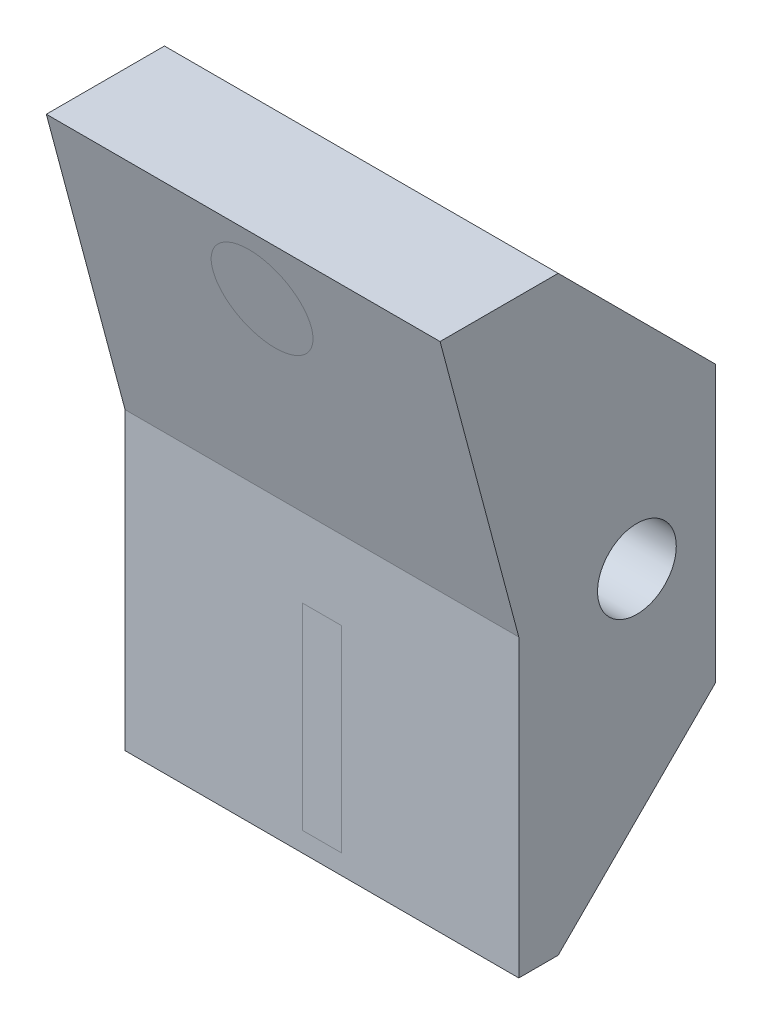
ISO-10303-21;
HEADER;
FILE_DESCRIPTION(('STEP AP214'),'2;1');
FILE_NAME('part.step','',(''),(''),'','','');
FILE_SCHEMA(('AUTOMOTIVE_DESIGN { 1 0 10303 214 1 1 1 1 }'));
ENDSEC;
DATA;
#1=APPLICATION_CONTEXT('core data for automotive mechanical design processes');
#2=APPLICATION_PROTOCOL_DEFINITION('international standard','automotive_design',2000,#1);
#3=PRODUCT_CONTEXT('',#1,'mechanical');
#4=PRODUCT('Part','Part','',(#3));
#5=PRODUCT_RELATED_PRODUCT_CATEGORY('part','',(#4));
#6=PRODUCT_DEFINITION_FORMATION('','',#4);
#7=PRODUCT_DEFINITION_CONTEXT('part definition',#1,'design');
#8=PRODUCT_DEFINITION('design','',#6,#7);
#9=PRODUCT_DEFINITION_SHAPE('','',#8);
#10=(LENGTH_UNIT() NAMED_UNIT(*) SI_UNIT(.MILLI.,.METRE.));
#11=(NAMED_UNIT(*) PLANE_ANGLE_UNIT() SI_UNIT($,.RADIAN.));
#12=(NAMED_UNIT(*) SI_UNIT($,.STERADIAN.) SOLID_ANGLE_UNIT());
#13=UNCERTAINTY_MEASURE_WITH_UNIT(LENGTH_MEASURE(1.E-05),#10,'distance_accuracy_value','');
#14=(GEOMETRIC_REPRESENTATION_CONTEXT(3) GLOBAL_UNCERTAINTY_ASSIGNED_CONTEXT((#13)) GLOBAL_UNIT_ASSIGNED_CONTEXT((#10,
#11,#12)) REPRESENTATION_CONTEXT('',''));
#15=CARTESIAN_POINT('',(0.,0.,0.));
#16=DIRECTION('',(0.,0.,1.));
#17=DIRECTION('',(1.,0.,0.));
#18=AXIS2_PLACEMENT_3D('',#15,#16,#17);
#19=CARTESIAN_POINT('',(0.,0.,63.5));
#20=DIRECTION('',(0.,0.,1.));
#21=DIRECTION('',(1.,0.,0.));
#22=AXIS2_PLACEMENT_3D('',#19,#20,#21);
#23=PLANE('',#22);
#24=DIRECTION('',(1.,0.,0.));
#25=VECTOR('',#24,1.);
#26=CARTESIAN_POINT('',(-63.5,0.,63.5));
#27=LINE('',#26,#25);
#28=CARTESIAN_POINT('',(-63.5,0.,63.5));
#29=VERTEX_POINT('',#28);
#30=CARTESIAN_POINT('',(63.5,0.,63.5));
#31=VERTEX_POINT('',#30);
#32=EDGE_CURVE('E126',#29,#31,#27,.T.);
#33=ORIENTED_EDGE('',*,*,#32,.F.);
#34=DIRECTION('',(0.,-1.,0.));
#35=VECTOR('',#34,1.);
#36=CARTESIAN_POINT('',(-63.5,-95.25,63.5));
#37=LINE('',#36,#35);
#38=CARTESIAN_POINT('',(-63.5,-95.25,63.5));
#39=VERTEX_POINT('',#38);
#40=EDGE_CURVE('E130',#29,#39,#37,.T.);
#41=ORIENTED_EDGE('',*,*,#40,.T.);
#42=DIRECTION('',(1.,0.,0.));
#43=VECTOR('',#42,1.);
#44=CARTESIAN_POINT('',(63.5,-95.25,63.5));
#45=LINE('',#44,#43);
#46=CARTESIAN_POINT('',(63.5,-95.25,63.5));
#47=VERTEX_POINT('',#46);
#48=EDGE_CURVE('E162',#39,#47,#45,.T.);
#49=ORIENTED_EDGE('',*,*,#48,.T.);
#50=DIRECTION('',(0.,1.,0.));
#51=VECTOR('',#50,1.);
#52=CARTESIAN_POINT('',(63.5,-95.25,63.5));
#53=LINE('',#52,#51);
#54=EDGE_CURVE('E116',#47,#31,#53,.T.);
#55=ORIENTED_EDGE('',*,*,#54,.T.);
#56=EDGE_LOOP('',(#33,#41,#49,#55));
#57=FACE_BOUND('',#56,.T.);
#58=DIRECTION('',(-1.,0.,0.));
#59=VECTOR('',#58,1.);
#60=CARTESIAN_POINT('',(0.,-88.9,63.5));
#61=LINE('',#60,#59);
#62=CARTESIAN_POINT('',(6.35,-88.9,63.5));
#63=VERTEX_POINT('',#62);
#64=CARTESIAN_POINT('',(-6.35,-88.9,63.5));
#65=VERTEX_POINT('',#64);
#66=EDGE_CURVE('E46',#63,#65,#61,.T.);
#67=ORIENTED_EDGE('',*,*,#66,.T.);
#68=DIRECTION('',(0.,1.,0.));
#69=VECTOR('',#68,1.);
#70=CARTESIAN_POINT('',(-6.35,0.,63.5));
#71=LINE('',#70,#69);
#72=CARTESIAN_POINT('',(-6.35,-25.4,63.5));
#73=VERTEX_POINT('',#72);
#74=EDGE_CURVE('E11',#65,#73,#71,.T.);
#75=ORIENTED_EDGE('',*,*,#74,.T.);
#76=DIRECTION('',(1.,0.,0.));
#77=VECTOR('',#76,1.);
#78=CARTESIAN_POINT('',(0.,-25.4,63.5));
#79=LINE('',#78,#77);
#80=CARTESIAN_POINT('',(6.35,-25.4,63.5));
#81=VERTEX_POINT('',#80);
#82=EDGE_CURVE('E180',#73,#81,#79,.T.);
#83=ORIENTED_EDGE('',*,*,#82,.T.);
#84=DIRECTION('',(0.,-1.,0.));
#85=VECTOR('',#84,1.);
#86=CARTESIAN_POINT('',(6.35,0.,63.5));
#87=LINE('',#86,#85);
#88=EDGE_CURVE('E184',#81,#63,#87,.T.);
#89=ORIENTED_EDGE('',*,*,#88,.T.);
#90=EDGE_LOOP('',(#67,#75,#83,#89));
#91=FACE_BOUND('',#90,.T.);
#92=ADVANCED_FACE('F37',(#57,#91),#23,.T.);
#93=CARTESIAN_POINT('',(-63.5,0.,63.5));
#94=DIRECTION('',(0.,-0.257662650560333,0.966234939601246));
#95=DIRECTION('',(0.,-0.966234939601246,-0.257662650560333));
#96=AXIS2_PLACEMENT_3D('',#93,#94,#95);
#97=PLANE('',#96);
#98=DIRECTION('',(0.,-0.966234939601246,-0.257662650560333));
#99=VECTOR('',#98,1.);
#100=CARTESIAN_POINT('',(63.5,0.,63.5));
#101=LINE('',#100,#99);
#102=CARTESIAN_POINT('',(63.5,95.25,88.9));
#103=VERTEX_POINT('',#102);
#104=EDGE_CURVE('E125',#103,#31,#101,.T.);
#105=ORIENTED_EDGE('',*,*,#104,.F.);
#106=DIRECTION('',(1.,0.,0.));
#107=VECTOR('',#106,1.);
#108=CARTESIAN_POINT('',(-63.5,95.25,88.9));
#109=LINE('',#108,#107);
#110=CARTESIAN_POINT('',(-63.5,95.25,88.9));
#111=VERTEX_POINT('',#110);
#112=EDGE_CURVE('E109',#111,#103,#109,.T.);
#113=ORIENTED_EDGE('',*,*,#112,.F.);
#114=DIRECTION('',(0.,-0.966234939601246,-0.257662650560333));
#115=VECTOR('',#114,1.);
#116=CARTESIAN_POINT('',(-63.5,0.,63.5));
#117=LINE('',#116,#115);
#118=EDGE_CURVE('E123',#111,#29,#117,.T.);
#119=ORIENTED_EDGE('',*,*,#118,.T.);
#120=ORIENTED_EDGE('',*,*,#32,.T.);
#121=EDGE_LOOP('',(#105,#113,#119,#120));
#122=FACE_BOUND('',#121,.T.);
#123=CARTESIAN_POINT('',(0.,72.39,82.804));
#124=DIRECTION('',(0.,-0.257662650560333,0.966234939601246));
#125=DIRECTION('',(0.,-0.966234939601246,-0.257662650560333));
#126=AXIS2_PLACEMENT_3D('',#123,#124,#125);
#127=ELLIPSE('',#126,16.4297515535419,15.875);
#128=CARTESIAN_POINT('',(0.,56.515,78.5706666666667));
#129=VERTEX_POINT('',#128);
#130=EDGE_CURVE('E176',#129,#129,#127,.F.);
#131=ORIENTED_EDGE('',*,*,#130,.T.);
#132=EDGE_LOOP('',(#131));
#133=FACE_BOUND('',#132,.T.);
#134=ADVANCED_FACE('F120',(#122,#133),#97,.T.);
#135=CARTESIAN_POINT('',(-63.5,-95.25,63.5));
#136=DIRECTION('',(1.,0.,0.));
#137=DIRECTION('',(0.,0.,-1.));
#138=AXIS2_PLACEMENT_3D('',#135,#136,#137);
#139=PLANE('',#138);
#140=CARTESIAN_POINT('',(-63.5,0.,25.4));
#141=DIRECTION('',(1.,0.,0.));
#142=DIRECTION('',(0.,0.,-1.));
#143=AXIS2_PLACEMENT_3D('',#140,#141,#142);
#144=CIRCLE('',#143,12.7);
#145=CARTESIAN_POINT('',(-63.5,0.,12.7));
#146=VERTEX_POINT('',#145);
#147=EDGE_CURVE('E145',#146,#146,#144,.T.);
#148=ORIENTED_EDGE('',*,*,#147,.T.);
#149=EDGE_LOOP('',(#148));
#150=FACE_BOUND('',#149,.T.);
#151=DIRECTION('',(0.,0.707106781186547,0.707106781186548));
#152=VECTOR('',#151,1.);
#153=CARTESIAN_POINT('',(-63.5,95.25,50.8));
#154=LINE('',#153,#152);
#155=CARTESIAN_POINT('',(-63.5,44.45,0.));
#156=VERTEX_POINT('',#155);
#157=CARTESIAN_POINT('',(-63.5,95.25,50.8));
#158=VERTEX_POINT('',#157);
#159=EDGE_CURVE('E134',#156,#158,#154,.T.);
#160=ORIENTED_EDGE('',*,*,#159,.F.);
#161=DIRECTION('',(0.,-1.,0.));
#162=VECTOR('',#161,1.);
#163=CARTESIAN_POINT('',(-63.5,-95.25,0.));
#164=LINE('',#163,#162);
#165=CARTESIAN_POINT('',(-63.5,-44.45,0.));
#166=VERTEX_POINT('',#165);
#167=EDGE_CURVE('E160',#156,#166,#164,.T.);
#168=ORIENTED_EDGE('',*,*,#167,.T.);
#169=DIRECTION('',(0.,-0.707106781186547,0.707106781186548));
#170=VECTOR('',#169,1.);
#171=CARTESIAN_POINT('',(-63.5,-95.25,50.8));
#172=LINE('',#171,#170);
#173=CARTESIAN_POINT('',(-63.5,-95.25,50.8));
#174=VERTEX_POINT('',#173);
#175=EDGE_CURVE('E148',#166,#174,#172,.T.);
#176=ORIENTED_EDGE('',*,*,#175,.T.);
#177=DIRECTION('',(0.,0.,-1.));
#178=VECTOR('',#177,1.);
#179=CARTESIAN_POINT('',(-63.5,-95.25,63.5));
#180=LINE('',#179,#178);
#181=EDGE_CURVE('E173',#39,#174,#180,.T.);
#182=ORIENTED_EDGE('',*,*,#181,.F.);
#183=ORIENTED_EDGE('',*,*,#40,.F.);
#184=ORIENTED_EDGE('',*,*,#118,.F.);
#185=DIRECTION('',(0.,0.,-1.));
#186=VECTOR('',#185,1.);
#187=CARTESIAN_POINT('',(-63.5,95.25,63.5));
#188=LINE('',#187,#186);
#189=EDGE_CURVE('E105',#111,#158,#188,.T.);
#190=ORIENTED_EDGE('',*,*,#189,.T.);
#191=EDGE_LOOP('',(#160,#168,#176,#182,#183,#184,#190));
#192=FACE_BOUND('',#191,.T.);
#193=ADVANCED_FACE('F39',(#150,#192),#139,.F.);
#194=CARTESIAN_POINT('',(63.5,-95.25,63.5));
#195=DIRECTION('',(-1.,0.,0.));
#196=DIRECTION('',(0.,0.,1.));
#197=AXIS2_PLACEMENT_3D('',#194,#195,#196);
#198=PLANE('',#197);
#199=CARTESIAN_POINT('',(63.5,0.,25.4));
#200=DIRECTION('',(1.,0.,0.));
#201=DIRECTION('',(0.,0.,-1.));
#202=AXIS2_PLACEMENT_3D('',#199,#200,#201);
#203=CIRCLE('',#202,12.7);
#204=CARTESIAN_POINT('',(63.5,0.,12.7));
#205=VERTEX_POINT('',#204);
#206=EDGE_CURVE('E142',#205,#205,#203,.T.);
#207=ORIENTED_EDGE('',*,*,#206,.F.);
#208=EDGE_LOOP('',(#207));
#209=FACE_BOUND('',#208,.T.);
#210=DIRECTION('',(0.,-0.707106781186547,-0.707106781186548));
#211=VECTOR('',#210,1.);
#212=CARTESIAN_POINT('',(63.5,95.25,50.8));
#213=LINE('',#212,#211);
#214=CARTESIAN_POINT('',(63.5,95.25,50.8));
#215=VERTEX_POINT('',#214);
#216=CARTESIAN_POINT('',(63.5,44.45,0.));
#217=VERTEX_POINT('',#216);
#218=EDGE_CURVE('E139',#215,#217,#213,.T.);
#219=ORIENTED_EDGE('',*,*,#218,.F.);
#220=DIRECTION('',(0.,0.,-1.));
#221=VECTOR('',#220,1.);
#222=CARTESIAN_POINT('',(63.5,95.25,63.5));
#223=LINE('',#222,#221);
#224=EDGE_CURVE('E115',#103,#215,#223,.T.);
#225=ORIENTED_EDGE('',*,*,#224,.F.);
#226=ORIENTED_EDGE('',*,*,#104,.T.);
#227=ORIENTED_EDGE('',*,*,#54,.F.);
#228=DIRECTION('',(0.,0.,-1.));
#229=VECTOR('',#228,1.);
#230=CARTESIAN_POINT('',(63.5,-95.25,63.5));
#231=LINE('',#230,#229);
#232=CARTESIAN_POINT('',(63.5,-95.25,50.8));
#233=VERTEX_POINT('',#232);
#234=EDGE_CURVE('E170',#47,#233,#231,.T.);
#235=ORIENTED_EDGE('',*,*,#234,.T.);
#236=DIRECTION('',(0.,0.707106781186547,-0.707106781186548));
#237=VECTOR('',#236,1.);
#238=CARTESIAN_POINT('',(63.5,-95.25,50.8));
#239=LINE('',#238,#237);
#240=CARTESIAN_POINT('',(63.5,-44.45,0.));
#241=VERTEX_POINT('',#240);
#242=EDGE_CURVE('E154',#233,#241,#239,.T.);
#243=ORIENTED_EDGE('',*,*,#242,.T.);
#244=DIRECTION('',(0.,1.,0.));
#245=VECTOR('',#244,1.);
#246=CARTESIAN_POINT('',(63.5,-95.25,0.));
#247=LINE('',#246,#245);
#248=EDGE_CURVE('E163',#241,#217,#247,.T.);
#249=ORIENTED_EDGE('',*,*,#248,.T.);
#250=EDGE_LOOP('',(#219,#225,#226,#227,#235,#243,#249));
#251=FACE_BOUND('',#250,.T.);
#252=ADVANCED_FACE('F215',(#209,#251),#198,.F.);
#253=CARTESIAN_POINT('',(0.,0.,0.));
#254=DIRECTION('',(0.,0.,1.));
#255=DIRECTION('',(1.,0.,0.));
#256=AXIS2_PLACEMENT_3D('',#253,#254,#255);
#257=PLANE('',#256);
#258=DIRECTION('',(-1.,0.,0.));
#259=VECTOR('',#258,1.);
#260=CARTESIAN_POINT('',(-63.5,44.45,0.));
#261=LINE('',#260,#259);
#262=EDGE_CURVE('E137',#217,#156,#261,.T.);
#263=ORIENTED_EDGE('',*,*,#262,.F.);
#264=ORIENTED_EDGE('',*,*,#248,.F.);
#265=DIRECTION('',(-1.,0.,0.));
#266=VECTOR('',#265,1.);
#267=CARTESIAN_POINT('',(-63.5,-44.45,0.));
#268=LINE('',#267,#266);
#269=EDGE_CURVE('E157',#241,#166,#268,.T.);
#270=ORIENTED_EDGE('',*,*,#269,.T.);
#271=ORIENTED_EDGE('',*,*,#167,.F.);
#272=EDGE_LOOP('',(#263,#264,#270,#271));
#273=FACE_BOUND('',#272,.T.);
#274=ADVANCED_FACE('F222',(#273),#257,.F.);
#275=CARTESIAN_POINT('',(63.5,95.25,63.5));
#276=DIRECTION('',(0.,-1.,0.));
#277=DIRECTION('',(0.,0.,-1.));
#278=AXIS2_PLACEMENT_3D('',#275,#276,#277);
#279=PLANE('',#278);
#280=DIRECTION('',(1.,0.,0.));
#281=VECTOR('',#280,1.);
#282=CARTESIAN_POINT('',(-63.5,95.25,50.8));
#283=LINE('',#282,#281);
#284=EDGE_CURVE('E111',#158,#215,#283,.T.);
#285=ORIENTED_EDGE('',*,*,#284,.F.);
#286=ORIENTED_EDGE('',*,*,#189,.F.);
#287=ORIENTED_EDGE('',*,*,#112,.T.);
#288=ORIENTED_EDGE('',*,*,#224,.T.);
#289=EDGE_LOOP('',(#285,#286,#287,#288));
#290=FACE_BOUND('',#289,.T.);
#291=ADVANCED_FACE('F107',(#290),#279,.F.);
#292=CARTESIAN_POINT('',(63.5,-95.25,63.5));
#293=DIRECTION('',(0.,1.,0.));
#294=DIRECTION('',(0.,0.,1.));
#295=AXIS2_PLACEMENT_3D('',#292,#293,#294);
#296=PLANE('',#295);
#297=DIRECTION('',(1.,0.,0.));
#298=VECTOR('',#297,1.);
#299=CARTESIAN_POINT('',(-63.5,-95.25,50.8));
#300=LINE('',#299,#298);
#301=EDGE_CURVE('E151',#174,#233,#300,.T.);
#302=ORIENTED_EDGE('',*,*,#301,.T.);
#303=ORIENTED_EDGE('',*,*,#234,.F.);
#304=ORIENTED_EDGE('',*,*,#48,.F.);
#305=ORIENTED_EDGE('',*,*,#181,.T.);
#306=EDGE_LOOP('',(#302,#303,#304,#305));
#307=FACE_BOUND('',#306,.T.);
#308=ADVANCED_FACE('F193',(#307),#296,.F.);
#309=ORIENTED_EDGE('',*,*,#74,.F.);
#310=ORIENTED_EDGE('',*,*,#66,.F.);
#311=ORIENTED_EDGE('',*,*,#88,.F.);
#312=ORIENTED_EDGE('',*,*,#82,.F.);
#313=EDGE_LOOP('',(#309,#310,#311,#312));
#314=FACE_BOUND('',#313,.T.);
#315=ADVANCED_FACE('F190',(#314),#23,.T.);
#316=CARTESIAN_POINT('',(0.,-22.225,-22.225));
#317=DIRECTION('',(0.,-0.707106781186548,-0.707106781186547));
#318=DIRECTION('',(0.,0.707106781186547,-0.707106781186548));
#319=AXIS2_PLACEMENT_3D('',#316,#317,#318);
#320=PLANE('',#319);
#321=ORIENTED_EDGE('',*,*,#175,.F.);
#322=ORIENTED_EDGE('',*,*,#269,.F.);
#323=ORIENTED_EDGE('',*,*,#242,.F.);
#324=ORIENTED_EDGE('',*,*,#301,.F.);
#325=EDGE_LOOP('',(#321,#322,#323,#324));
#326=FACE_BOUND('',#325,.T.);
#327=ADVANCED_FACE('F192',(#326),#320,.T.);
#328=CARTESIAN_POINT('',(-73.66,0.,25.4));
#329=DIRECTION('',(1.,0.,0.));
#330=DIRECTION('',(0.,0.,-1.));
#331=AXIS2_PLACEMENT_3D('',#328,#329,#330);
#332=CYLINDRICAL_SURFACE('',#331,12.7);
#333=ORIENTED_EDGE('',*,*,#206,.T.);
#334=EDGE_LOOP('',(#333));
#335=FACE_BOUND('',#334,.T.);
#336=ORIENTED_EDGE('',*,*,#147,.F.);
#337=EDGE_LOOP('',(#336));
#338=FACE_BOUND('',#337,.T.);
#339=ADVANCED_FACE('F199',(#335,#338),#332,.F.);
#340=CARTESIAN_POINT('',(0.,22.225,-22.225));
#341=DIRECTION('',(0.,0.707106781186548,-0.707106781186547));
#342=DIRECTION('',(0.,-0.707106781186547,-0.707106781186548));
#343=AXIS2_PLACEMENT_3D('',#340,#341,#342);
#344=PLANE('',#343);
#345=ORIENTED_EDGE('',*,*,#159,.T.);
#346=ORIENTED_EDGE('',*,*,#284,.T.);
#347=ORIENTED_EDGE('',*,*,#218,.T.);
#348=ORIENTED_EDGE('',*,*,#262,.T.);
#349=EDGE_LOOP('',(#345,#346,#347,#348));
#350=FACE_BOUND('',#349,.T.);
#351=ADVANCED_FACE('F219',(#350),#344,.T.);
#352=ORIENTED_EDGE('',*,*,#130,.F.);
#353=EDGE_LOOP('',(#352));
#354=FACE_BOUND('',#353,.T.);
#355=ADVANCED_FACE('F210',(#354),#97,.T.);
#356=CLOSED_SHELL('',(#92,#134,#193,#252,#274,#291,#308,#315,#327,#339,#351,#355));
#357=MANIFOLD_SOLID_BREP('B2',#356);
#358=ADVANCED_BREP_SHAPE_REPRESENTATION('',(#18,#357),#14);
#359=SHAPE_DEFINITION_REPRESENTATION(#9,#358);
ENDSEC;
END-ISO-10303-21;
